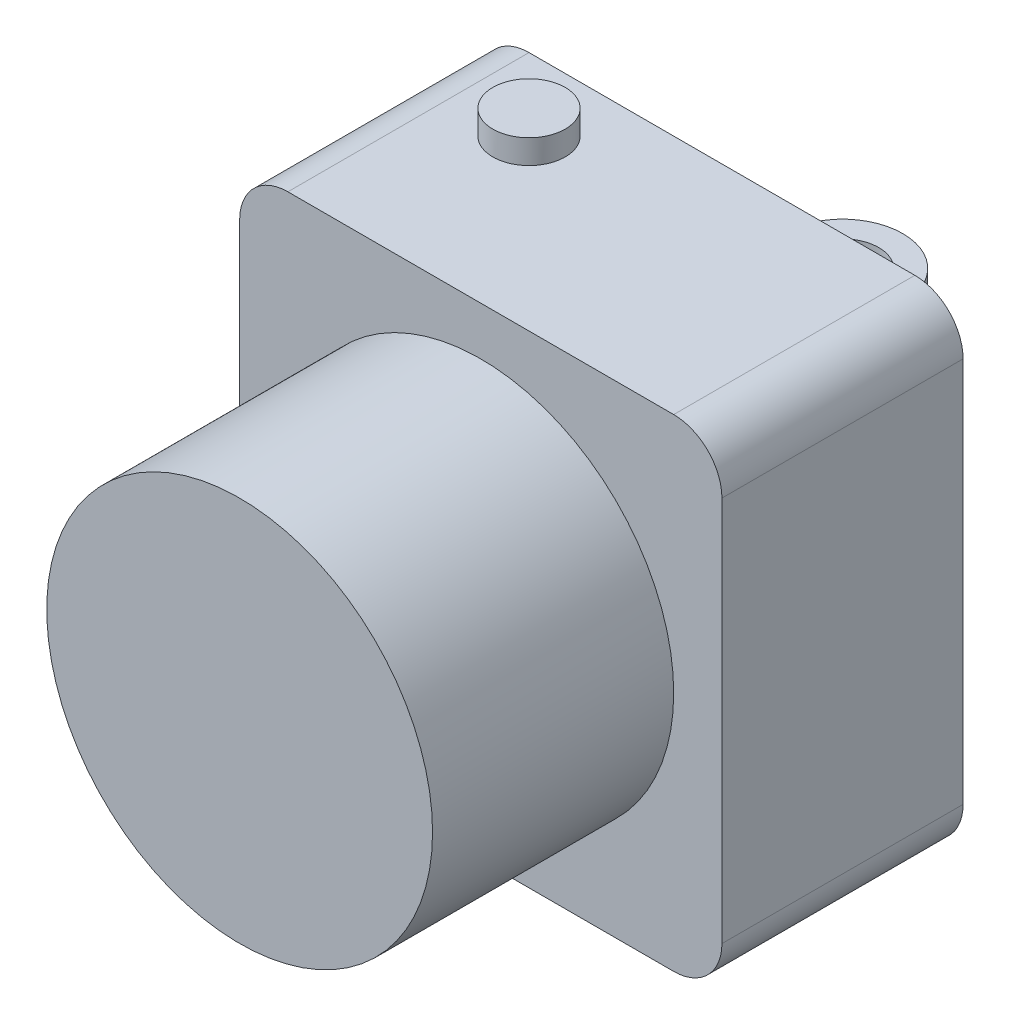
ISO-10303-21;
HEADER;
FILE_DESCRIPTION(('STEP AP214'),'2;1');
FILE_NAME('part.step','',(''),(''),'','','');
FILE_SCHEMA(('AUTOMOTIVE_DESIGN { 1 0 10303 214 1 1 1 1 }'));
ENDSEC;
DATA;
#1=APPLICATION_CONTEXT('core data for automotive mechanical design processes');
#2=APPLICATION_PROTOCOL_DEFINITION('international standard','automotive_design',2000,#1);
#3=PRODUCT_CONTEXT('',#1,'mechanical');
#4=PRODUCT('Part','Part','',(#3));
#5=PRODUCT_RELATED_PRODUCT_CATEGORY('part','',(#4));
#6=PRODUCT_DEFINITION_FORMATION('','',#4);
#7=PRODUCT_DEFINITION_CONTEXT('part definition',#1,'design');
#8=PRODUCT_DEFINITION('design','',#6,#7);
#9=PRODUCT_DEFINITION_SHAPE('','',#8);
#10=(LENGTH_UNIT() NAMED_UNIT(*) SI_UNIT(.MILLI.,.METRE.));
#11=(NAMED_UNIT(*) PLANE_ANGLE_UNIT() SI_UNIT($,.RADIAN.));
#12=(NAMED_UNIT(*) SI_UNIT($,.STERADIAN.) SOLID_ANGLE_UNIT());
#13=UNCERTAINTY_MEASURE_WITH_UNIT(LENGTH_MEASURE(1.E-05),#10,'distance_accuracy_value','');
#14=(GEOMETRIC_REPRESENTATION_CONTEXT(3) GLOBAL_UNCERTAINTY_ASSIGNED_CONTEXT((#13)) GLOBAL_UNIT_ASSIGNED_CONTEXT((#10,
#11,#12)) REPRESENTATION_CONTEXT('',''));
#15=CARTESIAN_POINT('',(0.,0.,0.));
#16=DIRECTION('',(0.,0.,1.));
#17=DIRECTION('',(1.,0.,0.));
#18=AXIS2_PLACEMENT_3D('',#15,#16,#17);
#19=CARTESIAN_POINT('',(0.,0.,-12.7));
#20=DIRECTION('',(0.,0.,1.));
#21=DIRECTION('',(1.,0.,0.));
#22=AXIS2_PLACEMENT_3D('',#19,#20,#21);
#23=PLANE('',#22);
#24=DIRECTION('',(1.,0.,0.));
#25=VECTOR('',#24,1.);
#26=CARTESIAN_POINT('',(-12.7,-12.7,-12.7));
#27=LINE('',#26,#25);
#28=CARTESIAN_POINT('',(-10.16,-12.7,-12.7));
#29=VERTEX_POINT('',#28);
#30=CARTESIAN_POINT('',(10.16,-12.7,-12.7));
#31=VERTEX_POINT('',#30);
#32=EDGE_CURVE('E212',#29,#31,#27,.T.);
#33=ORIENTED_EDGE('',*,*,#32,.F.);
#34=CARTESIAN_POINT('',(-10.16,-10.16,-12.7));
#35=DIRECTION('',(0.,0.,1.));
#36=DIRECTION('',(1.,0.,0.));
#37=AXIS2_PLACEMENT_3D('',#34,#35,#36);
#38=CIRCLE('',#37,2.54);
#39=CARTESIAN_POINT('',(-12.7,-10.16,-12.7));
#40=VERTEX_POINT('',#39);
#41=EDGE_CURVE('E232',#29,#40,#38,.F.);
#42=ORIENTED_EDGE('',*,*,#41,.T.);
#43=DIRECTION('',(0.,-1.,0.));
#44=VECTOR('',#43,1.);
#45=CARTESIAN_POINT('',(-12.7,12.7,-12.7));
#46=LINE('',#45,#44);
#47=CARTESIAN_POINT('',(-12.7,10.16,-12.7));
#48=VERTEX_POINT('',#47);
#49=EDGE_CURVE('E208',#48,#40,#46,.T.);
#50=ORIENTED_EDGE('',*,*,#49,.F.);
#51=CARTESIAN_POINT('',(-10.16,10.16,-12.7));
#52=DIRECTION('',(0.,0.,1.));
#53=DIRECTION('',(1.,0.,0.));
#54=AXIS2_PLACEMENT_3D('',#51,#52,#53);
#55=CIRCLE('',#54,2.54);
#56=CARTESIAN_POINT('',(-10.16,12.7,-12.7));
#57=VERTEX_POINT('',#56);
#58=EDGE_CURVE('E229',#48,#57,#55,.F.);
#59=ORIENTED_EDGE('',*,*,#58,.T.);
#60=DIRECTION('',(-1.,0.,0.));
#61=VECTOR('',#60,1.);
#62=CARTESIAN_POINT('',(-12.7,12.7,-12.7));
#63=LINE('',#62,#61);
#64=CARTESIAN_POINT('',(10.16,12.7,-12.7));
#65=VERTEX_POINT('',#64);
#66=EDGE_CURVE('E205',#65,#57,#63,.T.);
#67=ORIENTED_EDGE('',*,*,#66,.F.);
#68=CARTESIAN_POINT('',(10.16,10.16,-12.7));
#69=DIRECTION('',(0.,0.,1.));
#70=DIRECTION('',(1.,0.,0.));
#71=AXIS2_PLACEMENT_3D('',#68,#69,#70);
#72=CIRCLE('',#71,2.54);
#73=CARTESIAN_POINT('',(12.7,10.16,-12.7));
#74=VERTEX_POINT('',#73);
#75=EDGE_CURVE('E226',#65,#74,#72,.F.);
#76=ORIENTED_EDGE('',*,*,#75,.T.);
#77=DIRECTION('',(0.,1.,0.));
#78=VECTOR('',#77,1.);
#79=CARTESIAN_POINT('',(12.7,12.7,-12.7));
#80=LINE('',#79,#78);
#81=CARTESIAN_POINT('',(12.7,-10.16,-12.7));
#82=VERTEX_POINT('',#81);
#83=EDGE_CURVE('E201',#82,#74,#80,.T.);
#84=ORIENTED_EDGE('',*,*,#83,.F.);
#85=CARTESIAN_POINT('',(10.16,-10.16,-12.7));
#86=DIRECTION('',(0.,0.,1.));
#87=DIRECTION('',(1.,0.,0.));
#88=AXIS2_PLACEMENT_3D('',#85,#86,#87);
#89=CIRCLE('',#88,2.54);
#90=EDGE_CURVE('E223',#82,#31,#89,.F.);
#91=ORIENTED_EDGE('',*,*,#90,.T.);
#92=EDGE_LOOP('',(#33,#42,#50,#59,#67,#76,#84,#91));
#93=FACE_BOUND('',#92,.T.);
#94=DIRECTION('',(1.,0.,0.));
#95=VECTOR('',#94,1.);
#96=CARTESIAN_POINT('',(-3.175,4.7625,-12.7));
#97=LINE('',#96,#95);
#98=CARTESIAN_POINT('',(-3.175,4.7625,-12.7));
#99=VERTEX_POINT('',#98);
#100=CARTESIAN_POINT('',(3.175,4.7625,-12.7));
#101=VERTEX_POINT('',#100);
#102=EDGE_CURVE('E63',#99,#101,#97,.T.);
#103=ORIENTED_EDGE('',*,*,#102,.F.);
#104=DIRECTION('',(0.,1.,0.));
#105=VECTOR('',#104,1.);
#106=CARTESIAN_POINT('',(-3.175,-4.7625,-12.7));
#107=LINE('',#106,#105);
#108=CARTESIAN_POINT('',(-3.175,-4.7625,-12.7));
#109=VERTEX_POINT('',#108);
#110=EDGE_CURVE('E158',#109,#99,#107,.T.);
#111=ORIENTED_EDGE('',*,*,#110,.F.);
#112=DIRECTION('',(1.,0.,0.));
#113=VECTOR('',#112,1.);
#114=CARTESIAN_POINT('',(-3.175,-4.7625,-12.7));
#115=LINE('',#114,#113);
#116=CARTESIAN_POINT('',(3.175,-4.7625,-12.7));
#117=VERTEX_POINT('',#116);
#118=EDGE_CURVE('E142',#109,#117,#115,.T.);
#119=ORIENTED_EDGE('',*,*,#118,.T.);
#120=DIRECTION('',(0.,1.,0.));
#121=VECTOR('',#120,1.);
#122=CARTESIAN_POINT('',(3.175,-4.7625,-12.7));
#123=LINE('',#122,#121);
#124=EDGE_CURVE('E164',#117,#101,#123,.T.);
#125=ORIENTED_EDGE('',*,*,#124,.T.);
#126=EDGE_LOOP('',(#103,#111,#119,#125));
#127=FACE_BOUND('',#126,.T.);
#128=ADVANCED_FACE('F47',(#93,#127),#23,.F.);
#129=CARTESIAN_POINT('',(12.7,12.7,12.7));
#130=DIRECTION('',(-1.,0.,0.));
#131=DIRECTION('',(0.,0.,1.));
#132=AXIS2_PLACEMENT_3D('',#129,#130,#131);
#133=PLANE('',#132);
#134=ORIENTED_EDGE('',*,*,#83,.T.);
#135=DIRECTION('',(0.,0.,-1.));
#136=VECTOR('',#135,1.);
#137=CARTESIAN_POINT('',(12.7,10.16,12.7));
#138=LINE('',#137,#136);
#139=CARTESIAN_POINT('',(12.7,10.16,0.));
#140=VERTEX_POINT('',#139);
#141=EDGE_CURVE('E56',#74,#140,#138,.F.);
#142=ORIENTED_EDGE('',*,*,#141,.T.);
#143=DIRECTION('',(0.,1.,0.));
#144=VECTOR('',#143,1.);
#145=CARTESIAN_POINT('',(12.7,-12.7,0.));
#146=LINE('',#145,#144);
#147=CARTESIAN_POINT('',(12.7,-10.16,0.));
#148=VERTEX_POINT('',#147);
#149=EDGE_CURVE('E183',#148,#140,#146,.T.);
#150=ORIENTED_EDGE('',*,*,#149,.F.);
#151=DIRECTION('',(0.,0.,-1.));
#152=VECTOR('',#151,1.);
#153=CARTESIAN_POINT('',(12.7,-10.16,12.7));
#154=LINE('',#153,#152);
#155=EDGE_CURVE('E260',#148,#82,#154,.T.);
#156=ORIENTED_EDGE('',*,*,#155,.T.);
#157=EDGE_LOOP('',(#134,#142,#150,#156));
#158=FACE_BOUND('',#157,.T.);
#159=ADVANCED_FACE('F267',(#158),#133,.F.);
#160=CARTESIAN_POINT('',(-12.7,12.7,12.7));
#161=DIRECTION('',(0.,-1.,0.));
#162=DIRECTION('',(0.,0.,-1.));
#163=AXIS2_PLACEMENT_3D('',#160,#161,#162);
#164=PLANE('',#163);
#165=CARTESIAN_POINT('',(-6.35,12.7,-8.89));
#166=DIRECTION('',(0.,-1.,0.));
#167=DIRECTION('',(0.,0.,-1.));
#168=AXIS2_PLACEMENT_3D('',#165,#166,#167);
#169=CIRCLE('',#168,1.905);
#170=CARTESIAN_POINT('',(-6.35,12.7,-10.795));
#171=VERTEX_POINT('',#170);
#172=EDGE_CURVE('E11',#171,#171,#169,.F.);
#173=ORIENTED_EDGE('',*,*,#172,.F.);
#174=EDGE_LOOP('',(#173));
#175=FACE_BOUND('',#174,.T.);
#176=ORIENTED_EDGE('',*,*,#66,.T.);
#177=DIRECTION('',(0.,0.,-1.));
#178=VECTOR('',#177,1.);
#179=CARTESIAN_POINT('',(-10.16,12.7,12.7));
#180=LINE('',#179,#178);
#181=CARTESIAN_POINT('',(-10.16,12.7,0.));
#182=VERTEX_POINT('',#181);
#183=EDGE_CURVE('E71',#57,#182,#180,.F.);
#184=ORIENTED_EDGE('',*,*,#183,.T.);
#185=DIRECTION('',(-1.,0.,0.));
#186=VECTOR('',#185,1.);
#187=CARTESIAN_POINT('',(-12.7,12.7,0.));
#188=LINE('',#187,#186);
#189=CARTESIAN_POINT('',(10.16,12.7,0.));
#190=VERTEX_POINT('',#189);
#191=EDGE_CURVE('E190',#190,#182,#188,.T.);
#192=ORIENTED_EDGE('',*,*,#191,.F.);
#193=DIRECTION('',(0.,0.,-1.));
#194=VECTOR('',#193,1.);
#195=CARTESIAN_POINT('',(10.16,12.7,12.7));
#196=LINE('',#195,#194);
#197=EDGE_CURVE('E254',#190,#65,#196,.T.);
#198=ORIENTED_EDGE('',*,*,#197,.T.);
#199=EDGE_LOOP('',(#176,#184,#192,#198));
#200=FACE_BOUND('',#199,.T.);
#201=ADVANCED_FACE('F278',(#175,#200),#164,.F.);
#202=CARTESIAN_POINT('',(-12.7,12.7,12.7));
#203=DIRECTION('',(1.,0.,0.));
#204=DIRECTION('',(0.,0.,-1.));
#205=AXIS2_PLACEMENT_3D('',#202,#203,#204);
#206=PLANE('',#205);
#207=ORIENTED_EDGE('',*,*,#49,.T.);
#208=DIRECTION('',(0.,0.,-1.));
#209=VECTOR('',#208,1.);
#210=CARTESIAN_POINT('',(-12.7,-10.16,12.7));
#211=LINE('',#210,#209);
#212=CARTESIAN_POINT('',(-12.7,-10.16,0.));
#213=VERTEX_POINT('',#212);
#214=EDGE_CURVE('E239',#40,#213,#211,.F.);
#215=ORIENTED_EDGE('',*,*,#214,.T.);
#216=DIRECTION('',(0.,-1.,0.));
#217=VECTOR('',#216,1.);
#218=CARTESIAN_POINT('',(-12.7,-12.7,0.));
#219=LINE('',#218,#217);
#220=CARTESIAN_POINT('',(-12.7,10.16,0.));
#221=VERTEX_POINT('',#220);
#222=EDGE_CURVE('E193',#221,#213,#219,.T.);
#223=ORIENTED_EDGE('',*,*,#222,.F.);
#224=DIRECTION('',(0.,0.,-1.));
#225=VECTOR('',#224,1.);
#226=CARTESIAN_POINT('',(-12.7,10.16,12.7));
#227=LINE('',#226,#225);
#228=EDGE_CURVE('E235',#221,#48,#227,.T.);
#229=ORIENTED_EDGE('',*,*,#228,.T.);
#230=EDGE_LOOP('',(#207,#215,#223,#229));
#231=FACE_BOUND('',#230,.T.);
#232=ADVANCED_FACE('F288',(#231),#206,.F.);
#233=CARTESIAN_POINT('',(-12.7,-12.7,12.7));
#234=DIRECTION('',(0.,1.,0.));
#235=DIRECTION('',(0.,0.,1.));
#236=AXIS2_PLACEMENT_3D('',#233,#234,#235);
#237=PLANE('',#236);
#238=DIRECTION('',(1.,0.,0.));
#239=VECTOR('',#238,1.);
#240=CARTESIAN_POINT('',(-12.7,-12.7,0.));
#241=LINE('',#240,#239);
#242=CARTESIAN_POINT('',(-10.16,-12.7,0.));
#243=VERTEX_POINT('',#242);
#244=CARTESIAN_POINT('',(10.16,-12.7,0.));
#245=VERTEX_POINT('',#244);
#246=EDGE_CURVE('E197',#243,#245,#241,.T.);
#247=ORIENTED_EDGE('',*,*,#246,.F.);
#248=DIRECTION('',(0.,0.,-1.));
#249=VECTOR('',#248,1.);
#250=CARTESIAN_POINT('',(-10.16,-12.7,12.7));
#251=LINE('',#250,#249);
#252=EDGE_CURVE('E219',#243,#29,#251,.T.);
#253=ORIENTED_EDGE('',*,*,#252,.T.);
#254=ORIENTED_EDGE('',*,*,#32,.T.);
#255=DIRECTION('',(0.,0.,-1.));
#256=VECTOR('',#255,1.);
#257=CARTESIAN_POINT('',(10.16,-12.7,12.7));
#258=LINE('',#257,#256);
#259=EDGE_CURVE('E216',#31,#245,#258,.F.);
#260=ORIENTED_EDGE('',*,*,#259,.T.);
#261=EDGE_LOOP('',(#247,#253,#254,#260));
#262=FACE_BOUND('',#261,.T.);
#263=ADVANCED_FACE('F296',(#262),#237,.F.);
#264=CARTESIAN_POINT('',(0.,0.,0.));
#265=DIRECTION('',(0.,0.,-1.));
#266=DIRECTION('',(-1.,0.,0.));
#267=AXIS2_PLACEMENT_3D('',#264,#265,#266);
#268=PLANE('',#267);
#269=CARTESIAN_POINT('',(0.,0.,0.));
#270=DIRECTION('',(0.,0.,1.));
#271=DIRECTION('',(1.,0.,0.));
#272=AXIS2_PLACEMENT_3D('',#269,#270,#271);
#273=CIRCLE('',#272,10.16);
#274=CARTESIAN_POINT('',(10.16,0.,0.));
#275=VERTEX_POINT('',#274);
#276=EDGE_CURVE('E179',#275,#275,#273,.T.);
#277=ORIENTED_EDGE('',*,*,#276,.F.);
#278=EDGE_LOOP('',(#277));
#279=FACE_BOUND('',#278,.T.);
#280=ORIENTED_EDGE('',*,*,#222,.T.);
#281=CARTESIAN_POINT('',(-10.16,-10.16,0.));
#282=DIRECTION('',(0.,0.,-1.));
#283=DIRECTION('',(-1.,0.,0.));
#284=AXIS2_PLACEMENT_3D('',#281,#282,#283);
#285=CIRCLE('',#284,2.54);
#286=EDGE_CURVE('E251',#213,#243,#285,.F.);
#287=ORIENTED_EDGE('',*,*,#286,.T.);
#288=ORIENTED_EDGE('',*,*,#246,.T.);
#289=CARTESIAN_POINT('',(10.16,-10.16,0.));
#290=DIRECTION('',(0.,0.,-1.));
#291=DIRECTION('',(-1.,0.,0.));
#292=AXIS2_PLACEMENT_3D('',#289,#290,#291);
#293=CIRCLE('',#292,2.54);
#294=EDGE_CURVE('E242',#245,#148,#293,.F.);
#295=ORIENTED_EDGE('',*,*,#294,.T.);
#296=ORIENTED_EDGE('',*,*,#149,.T.);
#297=CARTESIAN_POINT('',(10.16,10.16,0.));
#298=DIRECTION('',(0.,0.,-1.));
#299=DIRECTION('',(-1.,0.,0.));
#300=AXIS2_PLACEMENT_3D('',#297,#298,#299);
#301=CIRCLE('',#300,2.54);
#302=EDGE_CURVE('E245',#140,#190,#301,.F.);
#303=ORIENTED_EDGE('',*,*,#302,.T.);
#304=ORIENTED_EDGE('',*,*,#191,.T.);
#305=CARTESIAN_POINT('',(-10.16,10.16,0.));
#306=DIRECTION('',(0.,0.,-1.));
#307=DIRECTION('',(-1.,0.,0.));
#308=AXIS2_PLACEMENT_3D('',#305,#306,#307);
#309=CIRCLE('',#308,2.54);
#310=EDGE_CURVE('E248',#182,#221,#309,.F.);
#311=ORIENTED_EDGE('',*,*,#310,.T.);
#312=EDGE_LOOP('',(#280,#287,#288,#295,#296,#303,#304,#311));
#313=FACE_BOUND('',#312,.T.);
#314=ADVANCED_FACE('F273',(#279,#313),#268,.F.);
#315=CARTESIAN_POINT('',(0.,0.,0.));
#316=DIRECTION('',(0.,0.,1.));
#317=DIRECTION('',(1.,0.,0.));
#318=AXIS2_PLACEMENT_3D('',#315,#316,#317);
#319=CYLINDRICAL_SURFACE('',#318,10.16);
#320=CARTESIAN_POINT('',(0.,0.,12.7));
#321=DIRECTION('',(0.,0.,1.));
#322=DIRECTION('',(1.,0.,0.));
#323=AXIS2_PLACEMENT_3D('',#320,#321,#322);
#324=CIRCLE('',#323,10.16);
#325=CARTESIAN_POINT('',(10.16,0.,12.7));
#326=VERTEX_POINT('',#325);
#327=EDGE_CURVE('E178',#326,#326,#324,.T.);
#328=CARTESIAN_POINT('',(10.16,0.,0.));
#329=CARTESIAN_POINT('',(10.16,0.,0.132291666666665));
#330=CARTESIAN_POINT('',(10.16,0.,0.264583333333332));
#331=CARTESIAN_POINT('',(10.16,0.,0.529166666666665));
#332=CARTESIAN_POINT('',(10.16,0.,0.661458333333332));
#333=CARTESIAN_POINT('',(10.16,0.,0.926041666666665));
#334=CARTESIAN_POINT('',(10.16,0.,1.05833333333333));
#335=CARTESIAN_POINT('',(10.16,0.,1.32291666666666));
#336=CARTESIAN_POINT('',(10.16,0.,1.45520833333333));
#337=CARTESIAN_POINT('',(10.16,0.,1.71979166666667));
#338=CARTESIAN_POINT('',(10.16,0.,1.85208333333333));
#339=CARTESIAN_POINT('',(10.16,0.,2.11666666666666));
#340=CARTESIAN_POINT('',(10.16,0.,2.24895833333333));
#341=CARTESIAN_POINT('',(10.16,0.,2.51354166666667));
#342=CARTESIAN_POINT('',(10.16,0.,2.64583333333333));
#343=CARTESIAN_POINT('',(10.16,0.,2.91041666666667));
#344=CARTESIAN_POINT('',(10.16,0.,3.04270833333333));
#345=CARTESIAN_POINT('',(10.16,0.,3.30729166666667));
#346=CARTESIAN_POINT('',(10.16,0.,3.43958333333333));
#347=CARTESIAN_POINT('',(10.16,0.,3.70416666666667));
#348=CARTESIAN_POINT('',(10.16,0.,3.83645833333333));
#349=CARTESIAN_POINT('',(10.16,0.,4.10104166666667));
#350=CARTESIAN_POINT('',(10.16,0.,4.23333333333333));
#351=CARTESIAN_POINT('',(10.16,0.,4.49791666666667));
#352=CARTESIAN_POINT('',(10.16,0.,4.63020833333333));
#353=CARTESIAN_POINT('',(10.16,0.,4.89479166666667));
#354=CARTESIAN_POINT('',(10.16,0.,5.02708333333333));
#355=CARTESIAN_POINT('',(10.16,0.,5.29166666666667));
#356=CARTESIAN_POINT('',(10.16,0.,5.42395833333333));
#357=CARTESIAN_POINT('',(10.16,0.,5.68854166666667));
#358=CARTESIAN_POINT('',(10.16,0.,5.82083333333333));
#359=CARTESIAN_POINT('',(10.16,0.,6.08541666666667));
#360=CARTESIAN_POINT('',(10.16,0.,6.21770833333333));
#361=CARTESIAN_POINT('',(10.16,0.,6.48229166666667));
#362=CARTESIAN_POINT('',(10.16,0.,6.61458333333333));
#363=CARTESIAN_POINT('',(10.16,0.,6.87916666666667));
#364=CARTESIAN_POINT('',(10.16,0.,7.01145833333333));
#365=CARTESIAN_POINT('',(10.16,0.,7.27604166666667));
#366=CARTESIAN_POINT('',(10.16,0.,7.40833333333333));
#367=CARTESIAN_POINT('',(10.16,0.,7.67291666666667));
#368=CARTESIAN_POINT('',(10.16,0.,7.80520833333333));
#369=CARTESIAN_POINT('',(10.16,0.,8.06979166666666));
#370=CARTESIAN_POINT('',(10.16,0.,8.20208333333333));
#371=CARTESIAN_POINT('',(10.16,0.,8.46666666666667));
#372=CARTESIAN_POINT('',(10.16,0.,8.59895833333333));
#373=CARTESIAN_POINT('',(10.16,0.,8.86354166666666));
#374=CARTESIAN_POINT('',(10.16,0.,8.99583333333333));
#375=CARTESIAN_POINT('',(10.16,0.,9.26041666666666));
#376=CARTESIAN_POINT('',(10.16,0.,9.39270833333333));
#377=CARTESIAN_POINT('',(10.16,0.,9.65729166666666));
#378=CARTESIAN_POINT('',(10.16,0.,9.78958333333333));
#379=CARTESIAN_POINT('',(10.16,0.,10.0541666666667));
#380=CARTESIAN_POINT('',(10.16,0.,10.1864583333333));
#381=CARTESIAN_POINT('',(10.16,0.,10.4510416666667));
#382=CARTESIAN_POINT('',(10.16,0.,10.5833333333333));
#383=CARTESIAN_POINT('',(10.16,0.,10.8479166666667));
#384=CARTESIAN_POINT('',(10.16,0.,10.9802083333333));
#385=CARTESIAN_POINT('',(10.16,0.,11.2447916666667));
#386=CARTESIAN_POINT('',(10.16,0.,11.3770833333333));
#387=CARTESIAN_POINT('',(10.16,0.,11.6416666666667));
#388=CARTESIAN_POINT('',(10.16,0.,11.7739583333333));
#389=CARTESIAN_POINT('',(10.16,0.,12.0385416666667));
#390=CARTESIAN_POINT('',(10.16,0.,12.1708333333333));
#391=CARTESIAN_POINT('',(10.16,0.,12.4354166666667));
#392=CARTESIAN_POINT('',(10.16,0.,12.5677083333333));
#393=CARTESIAN_POINT('',(10.16,0.,12.7));
#394=B_SPLINE_CURVE_WITH_KNOTS('',3,(#328,#329,#330,#331,#332,#333,#334,#335,#336,#337,#338,
#339,#340,#341,#342,#343,#344,#345,#346,#347,#348,#349,#350,#351,#352,#353,#354,#355,#356,#357,
#358,#359,#360,#361,#362,#363,#364,#365,#366,#367,#368,#369,#370,#371,#372,#373,#374,#375,#376,
#377,#378,#379,#380,#381,#382,#383,#384,#385,#386,#387,#388,#389,#390,#391,#392,#393),
.UNSPECIFIED.,.F.,.F.,(4,2,2,2,2,2,2,2,2,2,2,2,2,2,2,2,2,2,2,2,2,2,2,2,2,2,2,2,2,2,2,2,4),(0.,
0.396875,0.79375,1.190625,1.5875,1.984375,2.38125,2.778125,3.175,3.571875,3.96875,4.365625,
4.7625,5.159375,5.55625,5.953125,6.35,6.746875,7.14375,7.540625,7.9375,8.334375,8.73125,
9.128125,9.525,9.921875,10.31875,10.715625,11.1125,11.509375,11.90625,12.303125,12.7),.UNSPECIFIED.);
#395=EDGE_CURVE('BSEAM425',#275,#326,#394,.T.);
#396=ORIENTED_EDGE('',*,*,#276,.T.);
#397=ORIENTED_EDGE('',*,*,#327,.F.);
#398=ORIENTED_EDGE('',*,*,#395,.T.);
#399=ORIENTED_EDGE('',*,*,#395,.F.);
#400=EDGE_LOOP('',(#396,#398,#397,#399));
#401=FACE_BOUND('',#400,.T.);
#402=ADVANCED_FACE('F425',(#401),#319,.T.);
#403=CARTESIAN_POINT('',(0.,0.,12.7));
#404=DIRECTION('',(0.,0.,1.));
#405=DIRECTION('',(1.,0.,0.));
#406=AXIS2_PLACEMENT_3D('',#403,#404,#405);
#407=PLANE('',#406);
#408=ORIENTED_EDGE('',*,*,#327,.T.);
#409=EDGE_LOOP('',(#408));
#410=FACE_BOUND('',#409,.T.);
#411=ADVANCED_FACE('F319',(#410),#407,.T.);
#412=CARTESIAN_POINT('',(-10.16,-10.16,12.7));
#413=DIRECTION('',(0.,0.,-1.));
#414=DIRECTION('',(-1.,0.,0.));
#415=AXIS2_PLACEMENT_3D('',#412,#413,#414);
#416=CYLINDRICAL_SURFACE('',#415,2.54);
#417=ORIENTED_EDGE('',*,*,#286,.F.);
#418=ORIENTED_EDGE('',*,*,#214,.F.);
#419=ORIENTED_EDGE('',*,*,#41,.F.);
#420=ORIENTED_EDGE('',*,*,#252,.F.);
#421=EDGE_LOOP('',(#417,#418,#419,#420));
#422=FACE_BOUND('',#421,.T.);
#423=ADVANCED_FACE('F294',(#422),#416,.T.);
#424=CARTESIAN_POINT('',(-10.16,10.16,12.7));
#425=DIRECTION('',(0.,0.,-1.));
#426=DIRECTION('',(-1.,0.,0.));
#427=AXIS2_PLACEMENT_3D('',#424,#425,#426);
#428=CYLINDRICAL_SURFACE('',#427,2.54);
#429=ORIENTED_EDGE('',*,*,#310,.F.);
#430=ORIENTED_EDGE('',*,*,#183,.F.);
#431=ORIENTED_EDGE('',*,*,#58,.F.);
#432=ORIENTED_EDGE('',*,*,#228,.F.);
#433=EDGE_LOOP('',(#429,#430,#431,#432));
#434=FACE_BOUND('',#433,.T.);
#435=ADVANCED_FACE('F285',(#434),#428,.T.);
#436=CARTESIAN_POINT('',(10.16,10.16,12.7));
#437=DIRECTION('',(0.,0.,-1.));
#438=DIRECTION('',(-1.,0.,0.));
#439=AXIS2_PLACEMENT_3D('',#436,#437,#438);
#440=CYLINDRICAL_SURFACE('',#439,2.54);
#441=ORIENTED_EDGE('',*,*,#302,.F.);
#442=ORIENTED_EDGE('',*,*,#141,.F.);
#443=ORIENTED_EDGE('',*,*,#75,.F.);
#444=ORIENTED_EDGE('',*,*,#197,.F.);
#445=EDGE_LOOP('',(#441,#442,#443,#444));
#446=FACE_BOUND('',#445,.T.);
#447=ADVANCED_FACE('F276',(#446),#440,.T.);
#448=CARTESIAN_POINT('',(10.16,-10.16,12.7));
#449=DIRECTION('',(0.,0.,-1.));
#450=DIRECTION('',(-1.,0.,0.));
#451=AXIS2_PLACEMENT_3D('',#448,#449,#450);
#452=CYLINDRICAL_SURFACE('',#451,2.54);
#453=ORIENTED_EDGE('',*,*,#294,.F.);
#454=ORIENTED_EDGE('',*,*,#259,.F.);
#455=ORIENTED_EDGE('',*,*,#90,.F.);
#456=ORIENTED_EDGE('',*,*,#155,.F.);
#457=EDGE_LOOP('',(#453,#454,#455,#456));
#458=FACE_BOUND('',#457,.T.);
#459=ADVANCED_FACE('F49',(#458),#452,.T.);
#460=CARTESIAN_POINT('',(-6.35,13.97,-8.89));
#461=DIRECTION('',(0.,-1.,0.));
#462=DIRECTION('',(0.,0.,-1.));
#463=AXIS2_PLACEMENT_3D('',#460,#461,#462);
#464=CYLINDRICAL_SURFACE('',#463,1.905);
#465=CARTESIAN_POINT('',(-6.35,13.97,-8.89));
#466=DIRECTION('',(0.,1.,0.));
#467=DIRECTION('',(0.,0.,1.));
#468=AXIS2_PLACEMENT_3D('',#465,#466,#467);
#469=CIRCLE('',#468,1.905);
#470=CARTESIAN_POINT('',(-6.35,13.97,-6.985));
#471=VERTEX_POINT('',#470);
#472=EDGE_CURVE('E174',#471,#471,#469,.T.);
#473=ORIENTED_EDGE('',*,*,#472,.F.);
#474=EDGE_LOOP('',(#473));
#475=FACE_BOUND('',#474,.T.);
#476=ORIENTED_EDGE('',*,*,#172,.T.);
#477=EDGE_LOOP('',(#476));
#478=FACE_BOUND('',#477,.T.);
#479=ADVANCED_FACE('F300',(#475,#478),#464,.T.);
#480=CARTESIAN_POINT('',(-6.35,13.97,-8.89));
#481=DIRECTION('',(0.,1.,0.));
#482=DIRECTION('',(0.,0.,1.));
#483=AXIS2_PLACEMENT_3D('',#480,#481,#482);
#484=PLANE('',#483);
#485=ORIENTED_EDGE('',*,*,#472,.T.);
#486=EDGE_LOOP('',(#485));
#487=FACE_BOUND('',#486,.T.);
#488=ADVANCED_FACE('F306',(#487),#484,.T.);
#489=CARTESIAN_POINT('',(-3.175,-4.7625,-12.7));
#490=DIRECTION('',(-1.,0.,0.));
#491=DIRECTION('',(0.,0.,1.));
#492=AXIS2_PLACEMENT_3D('',#489,#490,#491);
#493=PLANE('',#492);
#494=DIRECTION('',(0.,0.,1.));
#495=VECTOR('',#494,1.);
#496=CARTESIAN_POINT('',(-3.175,4.7625,-12.7));
#497=LINE('',#496,#495);
#498=CARTESIAN_POINT('',(-3.175,4.7625,-19.05));
#499=VERTEX_POINT('',#498);
#500=EDGE_CURVE('E493',#499,#99,#497,.T.);
#501=ORIENTED_EDGE('',*,*,#500,.F.);
#502=DIRECTION('',(0.,1.,0.));
#503=VECTOR('',#502,1.);
#504=CARTESIAN_POINT('',(-3.175,-4.7625,-19.05));
#505=LINE('',#504,#503);
#506=CARTESIAN_POINT('',(-3.175,-4.7625,-19.05));
#507=VERTEX_POINT('',#506);
#508=EDGE_CURVE('E159',#507,#499,#505,.T.);
#509=ORIENTED_EDGE('',*,*,#508,.F.);
#510=DIRECTION('',(0.,0.,1.));
#511=VECTOR('',#510,1.);
#512=CARTESIAN_POINT('',(-3.175,-4.7625,-12.7));
#513=LINE('',#512,#511);
#514=EDGE_CURVE('E146',#507,#109,#513,.T.);
#515=ORIENTED_EDGE('',*,*,#514,.T.);
#516=ORIENTED_EDGE('',*,*,#110,.T.);
#517=EDGE_LOOP('',(#501,#509,#515,#516));
#518=FACE_BOUND('',#517,.T.);
#519=ADVANCED_FACE('F157',(#518),#493,.T.);
#520=CARTESIAN_POINT('',(0.,-4.7625,-19.05));
#521=DIRECTION('',(0.,1.,0.));
#522=DIRECTION('',(0.,0.,1.));
#523=AXIS2_PLACEMENT_3D('',#520,#521,#522);
#524=CYLINDRICAL_SURFACE('',#523,3.175);
#525=CARTESIAN_POINT('',(0.,4.7625,-19.05));
#526=DIRECTION('',(0.,1.,0.));
#527=DIRECTION('',(0.,0.,1.));
#528=AXIS2_PLACEMENT_3D('',#525,#526,#527);
#529=CIRCLE('',#528,3.175);
#530=CARTESIAN_POINT('',(3.175,4.7625,-19.05));
#531=VERTEX_POINT('',#530);
#532=EDGE_CURVE('E161',#531,#499,#529,.T.);
#533=ORIENTED_EDGE('',*,*,#532,.F.);
#534=DIRECTION('',(0.,1.,0.));
#535=VECTOR('',#534,1.);
#536=CARTESIAN_POINT('',(3.175,-4.7625,-19.05));
#537=LINE('',#536,#535);
#538=CARTESIAN_POINT('',(3.175,-4.7625,-19.05));
#539=VERTEX_POINT('',#538);
#540=EDGE_CURVE('E169',#539,#531,#537,.T.);
#541=ORIENTED_EDGE('',*,*,#540,.F.);
#542=CARTESIAN_POINT('',(0.,-4.7625,-19.05));
#543=DIRECTION('',(0.,1.,0.));
#544=DIRECTION('',(0.,0.,1.));
#545=AXIS2_PLACEMENT_3D('',#542,#543,#544);
#546=CIRCLE('',#545,3.175);
#547=EDGE_CURVE('E165',#539,#507,#546,.T.);
#548=ORIENTED_EDGE('',*,*,#547,.T.);
#549=ORIENTED_EDGE('',*,*,#508,.T.);
#550=EDGE_LOOP('',(#533,#541,#548,#549));
#551=FACE_BOUND('',#550,.T.);
#552=ADVANCED_FACE('F371',(#551),#524,.T.);
#553=CARTESIAN_POINT('',(3.175,-4.7625,-12.7));
#554=DIRECTION('',(1.,0.,0.));
#555=DIRECTION('',(0.,0.,-1.));
#556=AXIS2_PLACEMENT_3D('',#553,#554,#555);
#557=PLANE('',#556);
#558=DIRECTION('',(0.,0.,-1.));
#559=VECTOR('',#558,1.);
#560=CARTESIAN_POINT('',(3.175,4.7625,-12.7));
#561=LINE('',#560,#559);
#562=EDGE_CURVE('E502',#101,#531,#561,.T.);
#563=ORIENTED_EDGE('',*,*,#562,.F.);
#564=ORIENTED_EDGE('',*,*,#124,.F.);
#565=DIRECTION('',(0.,0.,-1.));
#566=VECTOR('',#565,1.);
#567=CARTESIAN_POINT('',(3.175,-4.7625,-12.7));
#568=LINE('',#567,#566);
#569=EDGE_CURVE('E149',#117,#539,#568,.T.);
#570=ORIENTED_EDGE('',*,*,#569,.T.);
#571=ORIENTED_EDGE('',*,*,#540,.T.);
#572=EDGE_LOOP('',(#563,#564,#570,#571));
#573=FACE_BOUND('',#572,.T.);
#574=ADVANCED_FACE('F380',(#573),#557,.T.);
#575=CARTESIAN_POINT('',(0.,-4.7625,-19.05));
#576=DIRECTION('',(0.,1.,0.));
#577=DIRECTION('',(0.,0.,1.));
#578=AXIS2_PLACEMENT_3D('',#575,#576,#577);
#579=PLANE('',#578);
#580=CARTESIAN_POINT('',(0.,-4.7625,-19.05));
#581=DIRECTION('',(0.,1.,0.));
#582=DIRECTION('',(0.,0.,1.));
#583=AXIS2_PLACEMENT_3D('',#580,#581,#582);
#584=CIRCLE('',#583,1.905);
#585=CARTESIAN_POINT('',(0.,-4.7625,-17.145));
#586=VERTEX_POINT('',#585);
#587=EDGE_CURVE('E486',#586,#586,#584,.T.);
#588=ORIENTED_EDGE('',*,*,#587,.T.);
#589=EDGE_LOOP('',(#588));
#590=FACE_BOUND('',#589,.T.);
#591=ORIENTED_EDGE('',*,*,#514,.F.);
#592=ORIENTED_EDGE('',*,*,#547,.F.);
#593=ORIENTED_EDGE('',*,*,#569,.F.);
#594=ORIENTED_EDGE('',*,*,#118,.F.);
#595=EDGE_LOOP('',(#591,#592,#593,#594));
#596=FACE_BOUND('',#595,.T.);
#597=ADVANCED_FACE('F144',(#590,#596),#579,.F.);
#598=CARTESIAN_POINT('',(0.,4.7625,-19.05));
#599=DIRECTION('',(0.,1.,0.));
#600=DIRECTION('',(0.,0.,1.));
#601=AXIS2_PLACEMENT_3D('',#598,#599,#600);
#602=PLANE('',#601);
#603=CARTESIAN_POINT('',(0.,4.7625,-19.05));
#604=DIRECTION('',(0.,1.,0.));
#605=DIRECTION('',(0.,0.,1.));
#606=AXIS2_PLACEMENT_3D('',#603,#604,#605);
#607=CIRCLE('',#606,1.905);
#608=CARTESIAN_POINT('',(0.,4.7625,-17.145));
#609=VERTEX_POINT('',#608);
#610=EDGE_CURVE('E489',#609,#609,#607,.T.);
#611=ORIENTED_EDGE('',*,*,#610,.F.);
#612=EDGE_LOOP('',(#611));
#613=FACE_BOUND('',#612,.T.);
#614=ORIENTED_EDGE('',*,*,#500,.T.);
#615=ORIENTED_EDGE('',*,*,#102,.T.);
#616=ORIENTED_EDGE('',*,*,#562,.T.);
#617=ORIENTED_EDGE('',*,*,#532,.T.);
#618=EDGE_LOOP('',(#614,#615,#616,#617));
#619=FACE_BOUND('',#618,.T.);
#620=ADVANCED_FACE('F399',(#613,#619),#602,.T.);
#621=CARTESIAN_POINT('',(0.,-4.7625,-19.05));
#622=DIRECTION('',(0.,1.,0.));
#623=DIRECTION('',(0.,0.,1.));
#624=AXIS2_PLACEMENT_3D('',#621,#622,#623);
#625=CYLINDRICAL_SURFACE('',#624,1.905);
#626=CARTESIAN_POINT('',(0.,-4.7625,-17.145));
#627=CARTESIAN_POINT('',(0.,-4.66328125,-17.145));
#628=CARTESIAN_POINT('',(0.,-4.5640625,-17.145));
#629=CARTESIAN_POINT('',(0.,-4.365625,-17.145));
#630=CARTESIAN_POINT('',(0.,-4.26640625,-17.145));
#631=CARTESIAN_POINT('',(0.,-4.06796875,-17.145));
#632=CARTESIAN_POINT('',(0.,-3.96875,-17.145));
#633=CARTESIAN_POINT('',(0.,-3.7703125,-17.145));
#634=CARTESIAN_POINT('',(0.,-3.67109375,-17.145));
#635=CARTESIAN_POINT('',(0.,-3.47265625,-17.145));
#636=CARTESIAN_POINT('',(0.,-3.3734375,-17.145));
#637=CARTESIAN_POINT('',(0.,-3.175,-17.145));
#638=CARTESIAN_POINT('',(0.,-3.07578125,-17.145));
#639=CARTESIAN_POINT('',(0.,-2.87734375,-17.145));
#640=CARTESIAN_POINT('',(0.,-2.778125,-17.145));
#641=CARTESIAN_POINT('',(0.,-2.5796875,-17.145));
#642=CARTESIAN_POINT('',(0.,-2.48046875,-17.145));
#643=CARTESIAN_POINT('',(0.,-2.28203125,-17.145));
#644=CARTESIAN_POINT('',(0.,-2.1828125,-17.145));
#645=CARTESIAN_POINT('',(0.,-1.984375,-17.145));
#646=CARTESIAN_POINT('',(0.,-1.88515625,-17.145));
#647=CARTESIAN_POINT('',(0.,-1.68671875,-17.145));
#648=CARTESIAN_POINT('',(0.,-1.5875,-17.145));
#649=CARTESIAN_POINT('',(0.,-1.3890625,-17.145));
#650=CARTESIAN_POINT('',(0.,-1.28984375,-17.145));
#651=CARTESIAN_POINT('',(0.,-1.09140625,-17.145));
#652=CARTESIAN_POINT('',(0.,-0.9921875,-17.145));
#653=CARTESIAN_POINT('',(0.,-0.79375,-17.145));
#654=CARTESIAN_POINT('',(0.,-0.69453125,-17.145));
#655=CARTESIAN_POINT('',(0.,-0.49609375,-17.145));
#656=CARTESIAN_POINT('',(0.,-0.396875,-17.145));
#657=CARTESIAN_POINT('',(0.,-0.1984375,-17.145));
#658=CARTESIAN_POINT('',(0.,-0.0992187500000001,-17.145));
#659=CARTESIAN_POINT('',(0.,0.0992187500000001,-17.145));
#660=CARTESIAN_POINT('',(0.,0.1984375,-17.145));
#661=CARTESIAN_POINT('',(0.,0.396875,-17.145));
#662=CARTESIAN_POINT('',(0.,0.49609375,-17.145));
#663=CARTESIAN_POINT('',(0.,0.69453125,-17.145));
#664=CARTESIAN_POINT('',(0.,0.793750000000001,-17.145));
#665=CARTESIAN_POINT('',(0.,0.992187500000001,-17.145));
#666=CARTESIAN_POINT('',(0.,1.09140625,-17.145));
#667=CARTESIAN_POINT('',(0.,1.28984375,-17.145));
#668=CARTESIAN_POINT('',(0.,1.3890625,-17.145));
#669=CARTESIAN_POINT('',(0.,1.5875,-17.145));
#670=CARTESIAN_POINT('',(0.,1.68671875,-17.145));
#671=CARTESIAN_POINT('',(0.,1.88515625,-17.145));
#672=CARTESIAN_POINT('',(0.,1.984375,-17.145));
#673=CARTESIAN_POINT('',(0.,2.1828125,-17.145));
#674=CARTESIAN_POINT('',(0.,2.28203125,-17.145));
#675=CARTESIAN_POINT('',(0.,2.48046875,-17.145));
#676=CARTESIAN_POINT('',(0.,2.5796875,-17.145));
#677=CARTESIAN_POINT('',(0.,2.778125,-17.145));
#678=CARTESIAN_POINT('',(0.,2.87734375,-17.145));
#679=CARTESIAN_POINT('',(0.,3.07578125,-17.145));
#680=CARTESIAN_POINT('',(0.,3.175,-17.145));
#681=CARTESIAN_POINT('',(0.,3.3734375,-17.145));
#682=CARTESIAN_POINT('',(0.,3.47265625,-17.145));
#683=CARTESIAN_POINT('',(0.,3.67109375,-17.145));
#684=CARTESIAN_POINT('',(0.,3.7703125,-17.145));
#685=CARTESIAN_POINT('',(0.,3.96875,-17.145));
#686=CARTESIAN_POINT('',(0.,4.06796875,-17.145));
#687=CARTESIAN_POINT('',(0.,4.26640625,-17.145));
#688=CARTESIAN_POINT('',(0.,4.365625,-17.145));
#689=CARTESIAN_POINT('',(0.,4.5640625,-17.145));
#690=CARTESIAN_POINT('',(0.,4.66328125,-17.145));
#691=CARTESIAN_POINT('',(0.,4.7625,-17.145));
#692=B_SPLINE_CURVE_WITH_KNOTS('',3,(#626,#627,#628,#629,#630,#631,#632,#633,#634,#635,#636,
#637,#638,#639,#640,#641,#642,#643,#644,#645,#646,#647,#648,#649,#650,#651,#652,#653,#654,#655,
#656,#657,#658,#659,#660,#661,#662,#663,#664,#665,#666,#667,#668,#669,#670,#671,#672,#673,#674,
#675,#676,#677,#678,#679,#680,#681,#682,#683,#684,#685,#686,#687,#688,#689,#690,#691),
.UNSPECIFIED.,.F.,.F.,(4,2,2,2,2,2,2,2,2,2,2,2,2,2,2,2,2,2,2,2,2,2,2,2,2,2,2,2,2,2,2,2,4),(0.,
0.297656249999999,0.595312499999999,0.89296875,1.190625,1.48828125,1.7859375,2.08359375,2.38125,
2.67890625,2.9765625,3.27421875,3.571875,3.86953125,4.1671875,4.46484375,4.7625,5.06015625,
5.3578125,5.65546875,5.953125,6.25078125,6.5484375,6.84609375,7.14375,7.44140625,7.7390625,
8.03671875,8.334375,8.63203125,8.9296875,9.22734375,9.525),.UNSPECIFIED.);
#693=EDGE_CURVE('BSEAM409',#586,#609,#692,.T.);
#694=ORIENTED_EDGE('',*,*,#587,.F.);
#695=ORIENTED_EDGE('',*,*,#610,.T.);
#696=ORIENTED_EDGE('',*,*,#693,.T.);
#697=ORIENTED_EDGE('',*,*,#693,.F.);
#698=EDGE_LOOP('',(#694,#696,#695,#697));
#699=FACE_BOUND('',#698,.T.);
#700=ADVANCED_FACE('F409',(#699),#625,.F.);
#701=CLOSED_SHELL('',(#128,#159,#201,#232,#263,#314,#402,#411,#423,#435,#447,#459,#479,#488,
#519,#552,#574,#597,#620,#700));
#702=MANIFOLD_SOLID_BREP('B2',#701);
#703=ADVANCED_BREP_SHAPE_REPRESENTATION('',(#18,#702),#14);
#704=SHAPE_DEFINITION_REPRESENTATION(#9,#703);
ENDSEC;
END-ISO-10303-21;
